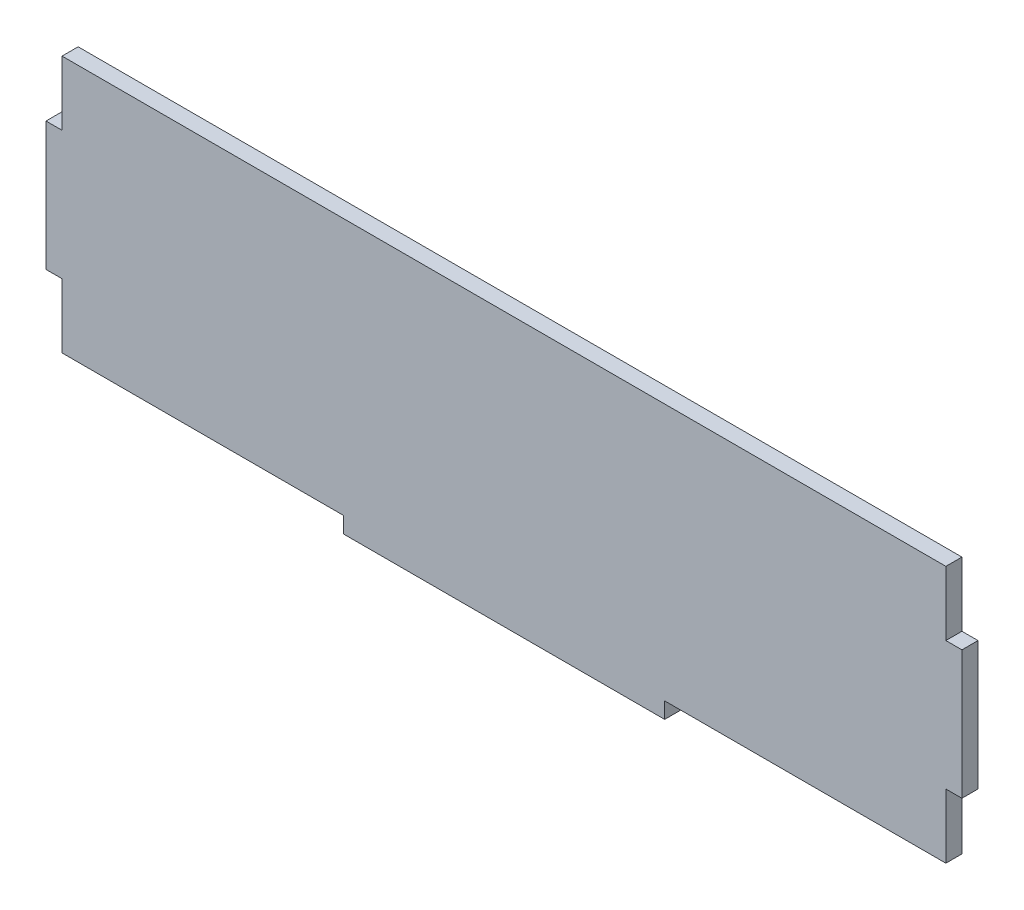
ISO-10303-21;
HEADER;
FILE_DESCRIPTION(('STEP AP214'),'2;1');
FILE_NAME('part.step','',(''),(''),'','','');
FILE_SCHEMA(('AUTOMOTIVE_DESIGN { 1 0 10303 214 1 1 1 1 }'));
ENDSEC;
DATA;
#1=APPLICATION_CONTEXT('core data for automotive mechanical design processes');
#2=APPLICATION_PROTOCOL_DEFINITION('international standard','automotive_design',2000,#1);
#3=PRODUCT_CONTEXT('',#1,'mechanical');
#4=PRODUCT('Part','Part','',(#3));
#5=PRODUCT_RELATED_PRODUCT_CATEGORY('part','',(#4));
#6=PRODUCT_DEFINITION_FORMATION('','',#4);
#7=PRODUCT_DEFINITION_CONTEXT('part definition',#1,'design');
#8=PRODUCT_DEFINITION('design','',#6,#7);
#9=PRODUCT_DEFINITION_SHAPE('','',#8);
#10=(LENGTH_UNIT() NAMED_UNIT(*) SI_UNIT(.MILLI.,.METRE.));
#11=(NAMED_UNIT(*) PLANE_ANGLE_UNIT() SI_UNIT($,.RADIAN.));
#12=(NAMED_UNIT(*) SI_UNIT($,.STERADIAN.) SOLID_ANGLE_UNIT());
#13=UNCERTAINTY_MEASURE_WITH_UNIT(LENGTH_MEASURE(1.E-05),#10,'distance_accuracy_value','');
#14=(GEOMETRIC_REPRESENTATION_CONTEXT(3) GLOBAL_UNCERTAINTY_ASSIGNED_CONTEXT((#13)) GLOBAL_UNIT_ASSIGNED_CONTEXT((#10,
#11,#12)) REPRESENTATION_CONTEXT('',''));
#15=CARTESIAN_POINT('',(0.,0.,0.));
#16=DIRECTION('',(0.,0.,1.));
#17=DIRECTION('',(1.,0.,0.));
#18=AXIS2_PLACEMENT_3D('',#15,#16,#17);
#19=CARTESIAN_POINT('',(275.,0.,5.));
#20=DIRECTION('',(-1.,0.,0.));
#21=DIRECTION('',(0.,0.,1.));
#22=AXIS2_PLACEMENT_3D('',#19,#20,#21);
#23=PLANE('',#22);
#24=DIRECTION('',(0.,0.,1.));
#25=VECTOR('',#24,1.);
#26=CARTESIAN_POINT('',(275.,60.,0.));
#27=LINE('',#26,#25);
#28=CARTESIAN_POINT('',(275.,60.,0.));
#29=VERTEX_POINT('',#28);
#30=CARTESIAN_POINT('',(275.,60.,5.));
#31=VERTEX_POINT('',#30);
#32=EDGE_CURVE('E258',#29,#31,#27,.T.);
#33=ORIENTED_EDGE('',*,*,#32,.F.);
#34=DIRECTION('',(0.,1.,0.));
#35=VECTOR('',#34,1.);
#36=CARTESIAN_POINT('',(275.,0.,0.));
#37=LINE('',#36,#35);
#38=CARTESIAN_POINT('',(275.,80.,0.));
#39=VERTEX_POINT('',#38);
#40=EDGE_CURVE('E171',#29,#39,#37,.T.);
#41=ORIENTED_EDGE('',*,*,#40,.T.);
#42=DIRECTION('',(0.,0.,-1.));
#43=VECTOR('',#42,1.);
#44=CARTESIAN_POINT('',(275.,80.,5.));
#45=LINE('',#44,#43);
#46=CARTESIAN_POINT('',(275.,80.,5.));
#47=VERTEX_POINT('',#46);
#48=EDGE_CURVE('E182',#47,#39,#45,.T.);
#49=ORIENTED_EDGE('',*,*,#48,.F.);
#50=DIRECTION('',(0.,1.,0.));
#51=VECTOR('',#50,1.);
#52=CARTESIAN_POINT('',(275.,0.,5.));
#53=LINE('',#52,#51);
#54=EDGE_CURVE('E208',#31,#47,#53,.T.);
#55=ORIENTED_EDGE('',*,*,#54,.F.);
#56=EDGE_LOOP('',(#33,#41,#49,#55));
#57=FACE_BOUND('',#56,.T.);
#58=ADVANCED_FACE('F33',(#57),#23,.F.);
#59=CARTESIAN_POINT('',(0.,0.,5.));
#60=DIRECTION('',(1.,0.,0.));
#61=DIRECTION('',(0.,0.,-1.));
#62=AXIS2_PLACEMENT_3D('',#59,#60,#61);
#63=PLANE('',#62);
#64=DIRECTION('',(0.,0.,1.));
#65=VECTOR('',#64,1.);
#66=CARTESIAN_POINT('',(0.,19.9999999999999,0.));
#67=LINE('',#66,#65);
#68=CARTESIAN_POINT('',(0.,19.9999999999999,0.));
#69=VERTEX_POINT('',#68);
#70=CARTESIAN_POINT('',(0.,19.9999999999999,5.));
#71=VERTEX_POINT('',#70);
#72=EDGE_CURVE('E242',#69,#71,#67,.T.);
#73=ORIENTED_EDGE('',*,*,#72,.F.);
#74=DIRECTION('',(0.,-1.,0.));
#75=VECTOR('',#74,1.);
#76=CARTESIAN_POINT('',(0.,0.,0.));
#77=LINE('',#76,#75);
#78=CARTESIAN_POINT('',(0.,0.,0.));
#79=VERTEX_POINT('',#78);
#80=EDGE_CURVE('E202',#69,#79,#77,.T.);
#81=ORIENTED_EDGE('',*,*,#80,.T.);
#82=DIRECTION('',(0.,0.,-1.));
#83=VECTOR('',#82,1.);
#84=CARTESIAN_POINT('',(0.,0.,5.));
#85=LINE('',#84,#83);
#86=CARTESIAN_POINT('',(0.,0.,5.));
#87=VERTEX_POINT('',#86);
#88=EDGE_CURVE('E11',#87,#79,#85,.T.);
#89=ORIENTED_EDGE('',*,*,#88,.F.);
#90=DIRECTION('',(0.,-1.,0.));
#91=VECTOR('',#90,1.);
#92=CARTESIAN_POINT('',(0.,0.,5.));
#93=LINE('',#92,#91);
#94=EDGE_CURVE('E173',#71,#87,#93,.T.);
#95=ORIENTED_EDGE('',*,*,#94,.F.);
#96=EDGE_LOOP('',(#73,#81,#89,#95));
#97=FACE_BOUND('',#96,.T.);
#98=ADVANCED_FACE('F307',(#97),#63,.F.);
#99=CARTESIAN_POINT('',(0.,0.,5.));
#100=DIRECTION('',(0.,1.,0.));
#101=DIRECTION('',(0.,0.,1.));
#102=AXIS2_PLACEMENT_3D('',#99,#100,#101);
#103=PLANE('',#102);
#104=DIRECTION('',(0.,0.,1.));
#105=VECTOR('',#104,1.);
#106=CARTESIAN_POINT('',(187.5,0.,0.));
#107=LINE('',#106,#105);
#108=CARTESIAN_POINT('',(187.5,0.,0.));
#109=VERTEX_POINT('',#108);
#110=CARTESIAN_POINT('',(187.5,0.,5.));
#111=VERTEX_POINT('',#110);
#112=EDGE_CURVE('E216',#109,#111,#107,.T.);
#113=ORIENTED_EDGE('',*,*,#112,.F.);
#114=DIRECTION('',(1.,0.,0.));
#115=VECTOR('',#114,1.);
#116=CARTESIAN_POINT('',(0.,0.,0.));
#117=LINE('',#116,#115);
#118=CARTESIAN_POINT('',(275.,0.,0.));
#119=VERTEX_POINT('',#118);
#120=EDGE_CURVE('E201',#109,#119,#117,.T.);
#121=ORIENTED_EDGE('',*,*,#120,.T.);
#122=DIRECTION('',(0.,0.,-1.));
#123=VECTOR('',#122,1.);
#124=CARTESIAN_POINT('',(275.,0.,5.));
#125=LINE('',#124,#123);
#126=CARTESIAN_POINT('',(275.,0.,5.));
#127=VERTEX_POINT('',#126);
#128=EDGE_CURVE('E41',#127,#119,#125,.T.);
#129=ORIENTED_EDGE('',*,*,#128,.F.);
#130=DIRECTION('',(1.,0.,0.));
#131=VECTOR('',#130,1.);
#132=CARTESIAN_POINT('',(0.,0.,5.));
#133=LINE('',#132,#131);
#134=EDGE_CURVE('E212',#111,#127,#133,.T.);
#135=ORIENTED_EDGE('',*,*,#134,.F.);
#136=EDGE_LOOP('',(#113,#121,#129,#135));
#137=FACE_BOUND('',#136,.T.);
#138=ADVANCED_FACE('F287',(#137),#103,.F.);
#139=CARTESIAN_POINT('',(0.,80.,0.));
#140=VERTEX_POINT('',#139);
#141=CARTESIAN_POINT('',(0.,60.,0.));
#142=VERTEX_POINT('',#141);
#143=EDGE_CURVE('E196',#140,#142,#77,.T.);
#144=ORIENTED_EDGE('',*,*,#143,.T.);
#145=DIRECTION('',(0.,0.,1.));
#146=VECTOR('',#145,1.);
#147=CARTESIAN_POINT('',(0.,60.,0.));
#148=LINE('',#147,#146);
#149=CARTESIAN_POINT('',(0.,60.,5.));
#150=VERTEX_POINT('',#149);
#151=EDGE_CURVE('E244',#142,#150,#148,.T.);
#152=ORIENTED_EDGE('',*,*,#151,.T.);
#153=CARTESIAN_POINT('',(0.,80.,5.));
#154=VERTEX_POINT('',#153);
#155=EDGE_CURVE('E213',#154,#150,#93,.T.);
#156=ORIENTED_EDGE('',*,*,#155,.F.);
#157=DIRECTION('',(0.,0.,-1.));
#158=VECTOR('',#157,1.);
#159=CARTESIAN_POINT('',(0.,80.,5.));
#160=LINE('',#159,#158);
#161=EDGE_CURVE('E179',#154,#140,#160,.T.);
#162=ORIENTED_EDGE('',*,*,#161,.T.);
#163=EDGE_LOOP('',(#144,#152,#156,#162));
#164=FACE_BOUND('',#163,.T.);
#165=ADVANCED_FACE('F35',(#164),#63,.F.);
#166=CARTESIAN_POINT('',(87.5,0.,0.));
#167=VERTEX_POINT('',#166);
#168=EDGE_CURVE('E175',#79,#167,#117,.T.);
#169=ORIENTED_EDGE('',*,*,#168,.T.);
#170=DIRECTION('',(0.,0.,1.));
#171=VECTOR('',#170,1.);
#172=CARTESIAN_POINT('',(87.5,0.,0.));
#173=LINE('',#172,#171);
#174=CARTESIAN_POINT('',(87.5,0.,5.));
#175=VERTEX_POINT('',#174);
#176=EDGE_CURVE('E218',#167,#175,#173,.T.);
#177=ORIENTED_EDGE('',*,*,#176,.T.);
#178=EDGE_CURVE('E209',#87,#175,#133,.T.);
#179=ORIENTED_EDGE('',*,*,#178,.F.);
#180=ORIENTED_EDGE('',*,*,#88,.T.);
#181=EDGE_LOOP('',(#169,#177,#179,#180));
#182=FACE_BOUND('',#181,.T.);
#183=ADVANCED_FACE('F301',(#182),#103,.F.);
#184=CARTESIAN_POINT('',(275.,19.9999999999999,0.));
#185=VERTEX_POINT('',#184);
#186=EDGE_CURVE('E161',#119,#185,#37,.T.);
#187=ORIENTED_EDGE('',*,*,#186,.T.);
#188=DIRECTION('',(0.,0.,1.));
#189=VECTOR('',#188,1.);
#190=CARTESIAN_POINT('',(275.,19.9999999999999,0.));
#191=LINE('',#190,#189);
#192=CARTESIAN_POINT('',(275.,19.9999999999999,5.));
#193=VERTEX_POINT('',#192);
#194=EDGE_CURVE('E144',#185,#193,#191,.T.);
#195=ORIENTED_EDGE('',*,*,#194,.T.);
#196=EDGE_CURVE('E206',#127,#193,#53,.T.);
#197=ORIENTED_EDGE('',*,*,#196,.F.);
#198=ORIENTED_EDGE('',*,*,#128,.T.);
#199=EDGE_LOOP('',(#187,#195,#197,#198));
#200=FACE_BOUND('',#199,.T.);
#201=ADVANCED_FACE('F168',(#200),#23,.F.);
#202=CARTESIAN_POINT('',(0.,80.,5.));
#203=DIRECTION('',(0.,-1.,0.));
#204=DIRECTION('',(0.,0.,-1.));
#205=AXIS2_PLACEMENT_3D('',#202,#203,#204);
#206=PLANE('',#205);
#207=DIRECTION('',(-1.,0.,0.));
#208=VECTOR('',#207,1.);
#209=CARTESIAN_POINT('',(0.,80.,0.));
#210=LINE('',#209,#208);
#211=EDGE_CURVE('E170',#39,#140,#210,.T.);
#212=ORIENTED_EDGE('',*,*,#211,.T.);
#213=ORIENTED_EDGE('',*,*,#161,.F.);
#214=DIRECTION('',(-1.,0.,0.));
#215=VECTOR('',#214,1.);
#216=CARTESIAN_POINT('',(0.,80.,5.));
#217=LINE('',#216,#215);
#218=EDGE_CURVE('E183',#47,#154,#217,.T.);
#219=ORIENTED_EDGE('',*,*,#218,.F.);
#220=ORIENTED_EDGE('',*,*,#48,.T.);
#221=EDGE_LOOP('',(#212,#213,#219,#220));
#222=FACE_BOUND('',#221,.T.);
#223=ADVANCED_FACE('F189',(#222),#206,.F.);
#224=CARTESIAN_POINT('',(0.,0.,5.));
#225=DIRECTION('',(0.,0.,-1.));
#226=DIRECTION('',(-1.,0.,0.));
#227=AXIS2_PLACEMENT_3D('',#224,#225,#226);
#228=PLANE('',#227);
#229=ORIENTED_EDGE('',*,*,#155,.T.);
#230=DIRECTION('',(-1.,0.,0.));
#231=VECTOR('',#230,1.);
#232=CARTESIAN_POINT('',(0.,60.,5.));
#233=LINE('',#232,#231);
#234=CARTESIAN_POINT('',(-5.00000000000001,59.9999999999999,5.));
#235=VERTEX_POINT('',#234);
#236=EDGE_CURVE('E56',#150,#235,#233,.T.);
#237=ORIENTED_EDGE('',*,*,#236,.T.);
#238=DIRECTION('',(0.,-1.,0.));
#239=VECTOR('',#238,1.);
#240=CARTESIAN_POINT('',(-5.00000000000001,59.9999999999999,5.));
#241=LINE('',#240,#239);
#242=CARTESIAN_POINT('',(-5.,20.,5.));
#243=VERTEX_POINT('',#242);
#244=EDGE_CURVE('E250',#235,#243,#241,.T.);
#245=ORIENTED_EDGE('',*,*,#244,.T.);
#246=DIRECTION('',(1.,0.,0.));
#247=VECTOR('',#246,1.);
#248=CARTESIAN_POINT('',(0.,19.9999999999999,5.));
#249=LINE('',#248,#247);
#250=EDGE_CURVE('E255',#243,#71,#249,.T.);
#251=ORIENTED_EDGE('',*,*,#250,.T.);
#252=ORIENTED_EDGE('',*,*,#94,.T.);
#253=ORIENTED_EDGE('',*,*,#178,.T.);
#254=DIRECTION('',(0.,-1.,0.));
#255=VECTOR('',#254,1.);
#256=CARTESIAN_POINT('',(87.5,0.,5.));
#257=LINE('',#256,#255);
#258=CARTESIAN_POINT('',(87.5,-4.99999999999999,5.));
#259=VERTEX_POINT('',#258);
#260=EDGE_CURVE('E229',#175,#259,#257,.T.);
#261=ORIENTED_EDGE('',*,*,#260,.T.);
#262=DIRECTION('',(1.,0.,0.));
#263=VECTOR('',#262,1.);
#264=CARTESIAN_POINT('',(87.5,-4.99999999999999,5.));
#265=LINE('',#264,#263);
#266=CARTESIAN_POINT('',(187.5,-4.99999999999998,5.));
#267=VERTEX_POINT('',#266);
#268=EDGE_CURVE('E225',#259,#267,#265,.T.);
#269=ORIENTED_EDGE('',*,*,#268,.T.);
#270=DIRECTION('',(0.,1.,0.));
#271=VECTOR('',#270,1.);
#272=CARTESIAN_POINT('',(187.5,0.,5.));
#273=LINE('',#272,#271);
#274=EDGE_CURVE('E232',#267,#111,#273,.T.);
#275=ORIENTED_EDGE('',*,*,#274,.T.);
#276=ORIENTED_EDGE('',*,*,#134,.T.);
#277=ORIENTED_EDGE('',*,*,#196,.T.);
#278=DIRECTION('',(1.,0.,0.));
#279=VECTOR('',#278,1.);
#280=CARTESIAN_POINT('',(275.,19.9999999999999,5.));
#281=LINE('',#280,#279);
#282=CARTESIAN_POINT('',(280.,20.0000000000001,5.));
#283=VERTEX_POINT('',#282);
#284=EDGE_CURVE('E48',#193,#283,#281,.T.);
#285=ORIENTED_EDGE('',*,*,#284,.T.);
#286=DIRECTION('',(0.,1.,0.));
#287=VECTOR('',#286,1.);
#288=CARTESIAN_POINT('',(280.,59.9999999999999,5.));
#289=LINE('',#288,#287);
#290=CARTESIAN_POINT('',(280.,59.9999999999999,5.));
#291=VERTEX_POINT('',#290);
#292=EDGE_CURVE('E269',#283,#291,#289,.T.);
#293=ORIENTED_EDGE('',*,*,#292,.T.);
#294=DIRECTION('',(-1.,0.,0.));
#295=VECTOR('',#294,1.);
#296=CARTESIAN_POINT('',(275.,60.,5.));
#297=LINE('',#296,#295);
#298=EDGE_CURVE('E165',#291,#31,#297,.T.);
#299=ORIENTED_EDGE('',*,*,#298,.T.);
#300=ORIENTED_EDGE('',*,*,#54,.T.);
#301=ORIENTED_EDGE('',*,*,#218,.T.);
#302=EDGE_LOOP('',(#229,#237,#245,#251,#252,#253,#261,#269,#275,#276,#277,#285,#293,#299,#300,#301));
#303=FACE_BOUND('',#302,.T.);
#304=ADVANCED_FACE('F282',(#303),#228,.F.);
#305=CARTESIAN_POINT('',(0.,0.,0.));
#306=DIRECTION('',(0.,0.,-1.));
#307=DIRECTION('',(-1.,0.,0.));
#308=AXIS2_PLACEMENT_3D('',#305,#306,#307);
#309=PLANE('',#308);
#310=ORIENTED_EDGE('',*,*,#143,.F.);
#311=ORIENTED_EDGE('',*,*,#211,.F.);
#312=ORIENTED_EDGE('',*,*,#40,.F.);
#313=DIRECTION('',(-1.,0.,0.));
#314=VECTOR('',#313,1.);
#315=CARTESIAN_POINT('',(275.,60.,0.));
#316=LINE('',#315,#314);
#317=CARTESIAN_POINT('',(280.,59.9999999999999,0.));
#318=VERTEX_POINT('',#317);
#319=EDGE_CURVE('E153',#318,#29,#316,.T.);
#320=ORIENTED_EDGE('',*,*,#319,.F.);
#321=DIRECTION('',(0.,1.,0.));
#322=VECTOR('',#321,1.);
#323=CARTESIAN_POINT('',(280.,59.9999999999999,0.));
#324=LINE('',#323,#322);
#325=CARTESIAN_POINT('',(280.,20.0000000000001,0.));
#326=VERTEX_POINT('',#325);
#327=EDGE_CURVE('E164',#326,#318,#324,.T.);
#328=ORIENTED_EDGE('',*,*,#327,.F.);
#329=DIRECTION('',(1.,0.,0.));
#330=VECTOR('',#329,1.);
#331=CARTESIAN_POINT('',(275.,19.9999999999999,0.));
#332=LINE('',#331,#330);
#333=EDGE_CURVE('E147',#185,#326,#332,.T.);
#334=ORIENTED_EDGE('',*,*,#333,.F.);
#335=ORIENTED_EDGE('',*,*,#186,.F.);
#336=ORIENTED_EDGE('',*,*,#120,.F.);
#337=DIRECTION('',(0.,1.,0.));
#338=VECTOR('',#337,1.);
#339=CARTESIAN_POINT('',(187.5,0.,0.));
#340=LINE('',#339,#338);
#341=CARTESIAN_POINT('',(187.5,-4.99999999999998,0.));
#342=VERTEX_POINT('',#341);
#343=EDGE_CURVE('E228',#342,#109,#340,.T.);
#344=ORIENTED_EDGE('',*,*,#343,.F.);
#345=DIRECTION('',(1.,0.,0.));
#346=VECTOR('',#345,1.);
#347=CARTESIAN_POINT('',(87.5,-4.99999999999999,0.));
#348=LINE('',#347,#346);
#349=CARTESIAN_POINT('',(87.5,-4.99999999999999,0.));
#350=VERTEX_POINT('',#349);
#351=EDGE_CURVE('E219',#350,#342,#348,.T.);
#352=ORIENTED_EDGE('',*,*,#351,.F.);
#353=DIRECTION('',(0.,-1.,0.));
#354=VECTOR('',#353,1.);
#355=CARTESIAN_POINT('',(87.5,0.,0.));
#356=LINE('',#355,#354);
#357=EDGE_CURVE('E238',#167,#350,#356,.T.);
#358=ORIENTED_EDGE('',*,*,#357,.F.);
#359=ORIENTED_EDGE('',*,*,#168,.F.);
#360=ORIENTED_EDGE('',*,*,#80,.F.);
#361=DIRECTION('',(1.,0.,0.));
#362=VECTOR('',#361,1.);
#363=CARTESIAN_POINT('',(0.,19.9999999999999,0.));
#364=LINE('',#363,#362);
#365=CARTESIAN_POINT('',(-5.,20.,0.));
#366=VERTEX_POINT('',#365);
#367=EDGE_CURVE('E253',#366,#69,#364,.T.);
#368=ORIENTED_EDGE('',*,*,#367,.F.);
#369=DIRECTION('',(0.,-1.,0.));
#370=VECTOR('',#369,1.);
#371=CARTESIAN_POINT('',(-5.00000000000001,59.9999999999999,0.));
#372=LINE('',#371,#370);
#373=CARTESIAN_POINT('',(-5.00000000000001,59.9999999999999,0.));
#374=VERTEX_POINT('',#373);
#375=EDGE_CURVE('E245',#374,#366,#372,.T.);
#376=ORIENTED_EDGE('',*,*,#375,.F.);
#377=DIRECTION('',(-1.,0.,0.));
#378=VECTOR('',#377,1.);
#379=CARTESIAN_POINT('',(0.,60.,0.));
#380=LINE('',#379,#378);
#381=EDGE_CURVE('E199',#142,#374,#380,.T.);
#382=ORIENTED_EDGE('',*,*,#381,.F.);
#383=EDGE_LOOP('',(#310,#311,#312,#320,#328,#334,#335,#336,#344,#352,#358,#359,#360,#368,#376,#382));
#384=FACE_BOUND('',#383,.T.);
#385=ADVANCED_FACE('F159',(#384),#309,.T.);
#386=CARTESIAN_POINT('',(187.5,0.,0.));
#387=DIRECTION('',(1.,0.,0.));
#388=DIRECTION('',(0.,1.,0.));
#389=AXIS2_PLACEMENT_3D('',#386,#387,#388);
#390=PLANE('',#389);
#391=ORIENTED_EDGE('',*,*,#274,.F.);
#392=DIRECTION('',(0.,0.,1.));
#393=VECTOR('',#392,1.);
#394=CARTESIAN_POINT('',(187.5,-4.99999999999998,0.));
#395=LINE('',#394,#393);
#396=EDGE_CURVE('E203',#342,#267,#395,.T.);
#397=ORIENTED_EDGE('',*,*,#396,.F.);
#398=ORIENTED_EDGE('',*,*,#343,.T.);
#399=ORIENTED_EDGE('',*,*,#112,.T.);
#400=EDGE_LOOP('',(#391,#397,#398,#399));
#401=FACE_BOUND('',#400,.T.);
#402=ADVANCED_FACE('F377',(#401),#390,.T.);
#403=CARTESIAN_POINT('',(87.5,-4.99999999999999,0.));
#404=DIRECTION('',(0.,-1.,0.));
#405=DIRECTION('',(1.,0.,0.));
#406=AXIS2_PLACEMENT_3D('',#403,#404,#405);
#407=PLANE('',#406);
#408=ORIENTED_EDGE('',*,*,#268,.F.);
#409=DIRECTION('',(0.,0.,1.));
#410=VECTOR('',#409,1.);
#411=CARTESIAN_POINT('',(87.5,-4.99999999999999,0.));
#412=LINE('',#411,#410);
#413=EDGE_CURVE('E222',#350,#259,#412,.T.);
#414=ORIENTED_EDGE('',*,*,#413,.F.);
#415=ORIENTED_EDGE('',*,*,#351,.T.);
#416=ORIENTED_EDGE('',*,*,#396,.T.);
#417=EDGE_LOOP('',(#408,#414,#415,#416));
#418=FACE_BOUND('',#417,.T.);
#419=ADVANCED_FACE('F294',(#418),#407,.T.);
#420=CARTESIAN_POINT('',(87.5,0.,0.));
#421=DIRECTION('',(-1.,0.,0.));
#422=DIRECTION('',(0.,0.,1.));
#423=AXIS2_PLACEMENT_3D('',#420,#421,#422);
#424=PLANE('',#423);
#425=ORIENTED_EDGE('',*,*,#260,.F.);
#426=ORIENTED_EDGE('',*,*,#176,.F.);
#427=ORIENTED_EDGE('',*,*,#357,.T.);
#428=ORIENTED_EDGE('',*,*,#413,.T.);
#429=EDGE_LOOP('',(#425,#426,#427,#428));
#430=FACE_BOUND('',#429,.T.);
#431=ADVANCED_FACE('F296',(#430),#424,.T.);
#432=CARTESIAN_POINT('',(0.,19.9999999999999,0.));
#433=DIRECTION('',(0.,-1.,0.));
#434=DIRECTION('',(1.,0.,0.));
#435=AXIS2_PLACEMENT_3D('',#432,#433,#434);
#436=PLANE('',#435);
#437=ORIENTED_EDGE('',*,*,#250,.F.);
#438=DIRECTION('',(0.,0.,1.));
#439=VECTOR('',#438,1.);
#440=CARTESIAN_POINT('',(-5.,20.,0.));
#441=LINE('',#440,#439);
#442=EDGE_CURVE('E235',#366,#243,#441,.T.);
#443=ORIENTED_EDGE('',*,*,#442,.F.);
#444=ORIENTED_EDGE('',*,*,#367,.T.);
#445=ORIENTED_EDGE('',*,*,#72,.T.);
#446=EDGE_LOOP('',(#437,#443,#444,#445));
#447=FACE_BOUND('',#446,.T.);
#448=ADVANCED_FACE('F316',(#447),#436,.T.);
#449=CARTESIAN_POINT('',(-5.00000000000001,59.9999999999999,0.));
#450=DIRECTION('',(-1.,0.,0.));
#451=DIRECTION('',(0.,-1.,0.));
#452=AXIS2_PLACEMENT_3D('',#449,#450,#451);
#453=PLANE('',#452);
#454=ORIENTED_EDGE('',*,*,#244,.F.);
#455=DIRECTION('',(0.,0.,1.));
#456=VECTOR('',#455,1.);
#457=CARTESIAN_POINT('',(-5.00000000000001,59.9999999999999,0.));
#458=LINE('',#457,#456);
#459=EDGE_CURVE('E247',#374,#235,#458,.T.);
#460=ORIENTED_EDGE('',*,*,#459,.F.);
#461=ORIENTED_EDGE('',*,*,#375,.T.);
#462=ORIENTED_EDGE('',*,*,#442,.T.);
#463=EDGE_LOOP('',(#454,#460,#461,#462));
#464=FACE_BOUND('',#463,.T.);
#465=ADVANCED_FACE('F312',(#464),#453,.T.);
#466=CARTESIAN_POINT('',(0.,60.,0.));
#467=DIRECTION('',(0.,1.,0.));
#468=DIRECTION('',(-1.,0.,0.));
#469=AXIS2_PLACEMENT_3D('',#466,#467,#468);
#470=PLANE('',#469);
#471=ORIENTED_EDGE('',*,*,#236,.F.);
#472=ORIENTED_EDGE('',*,*,#151,.F.);
#473=ORIENTED_EDGE('',*,*,#381,.T.);
#474=ORIENTED_EDGE('',*,*,#459,.T.);
#475=EDGE_LOOP('',(#471,#472,#473,#474));
#476=FACE_BOUND('',#475,.T.);
#477=ADVANCED_FACE('F314',(#476),#470,.T.);
#478=CARTESIAN_POINT('',(275.,60.,0.));
#479=DIRECTION('',(0.,1.,0.));
#480=DIRECTION('',(-1.,0.,0.));
#481=AXIS2_PLACEMENT_3D('',#478,#479,#480);
#482=PLANE('',#481);
#483=ORIENTED_EDGE('',*,*,#298,.F.);
#484=DIRECTION('',(0.,0.,1.));
#485=VECTOR('',#484,1.);
#486=CARTESIAN_POINT('',(280.,59.9999999999999,0.));
#487=LINE('',#486,#485);
#488=EDGE_CURVE('E264',#318,#291,#487,.T.);
#489=ORIENTED_EDGE('',*,*,#488,.F.);
#490=ORIENTED_EDGE('',*,*,#319,.T.);
#491=ORIENTED_EDGE('',*,*,#32,.T.);
#492=EDGE_LOOP('',(#483,#489,#490,#491));
#493=FACE_BOUND('',#492,.T.);
#494=ADVANCED_FACE('F280',(#493),#482,.T.);
#495=CARTESIAN_POINT('',(280.,59.9999999999999,0.));
#496=DIRECTION('',(1.,0.,0.));
#497=DIRECTION('',(0.,0.,-1.));
#498=AXIS2_PLACEMENT_3D('',#495,#496,#497);
#499=PLANE('',#498);
#500=ORIENTED_EDGE('',*,*,#292,.F.);
#501=DIRECTION('',(0.,0.,1.));
#502=VECTOR('',#501,1.);
#503=CARTESIAN_POINT('',(280.,20.0000000000001,0.));
#504=LINE('',#503,#502);
#505=EDGE_CURVE('E152',#326,#283,#504,.T.);
#506=ORIENTED_EDGE('',*,*,#505,.F.);
#507=ORIENTED_EDGE('',*,*,#327,.T.);
#508=ORIENTED_EDGE('',*,*,#488,.T.);
#509=EDGE_LOOP('',(#500,#506,#507,#508));
#510=FACE_BOUND('',#509,.T.);
#511=ADVANCED_FACE('F276',(#510),#499,.T.);
#512=CARTESIAN_POINT('',(275.,19.9999999999999,0.));
#513=DIRECTION('',(0.,-1.,0.));
#514=DIRECTION('',(1.,0.,0.));
#515=AXIS2_PLACEMENT_3D('',#512,#513,#514);
#516=PLANE('',#515);
#517=ORIENTED_EDGE('',*,*,#284,.F.);
#518=ORIENTED_EDGE('',*,*,#194,.F.);
#519=ORIENTED_EDGE('',*,*,#333,.T.);
#520=ORIENTED_EDGE('',*,*,#505,.T.);
#521=EDGE_LOOP('',(#517,#518,#519,#520));
#522=FACE_BOUND('',#521,.T.);
#523=ADVANCED_FACE('F146',(#522),#516,.T.);
#524=CLOSED_SHELL('',(#58,#98,#138,#165,#183,#201,#223,#304,#385,#402,#419,#431,#448,#465,#477,
#494,#511,#523));
#525=MANIFOLD_SOLID_BREP('B2',#524);
#526=ADVANCED_BREP_SHAPE_REPRESENTATION('',(#18,#525),#14);
#527=SHAPE_DEFINITION_REPRESENTATION(#9,#526);
ENDSEC;
END-ISO-10303-21;
